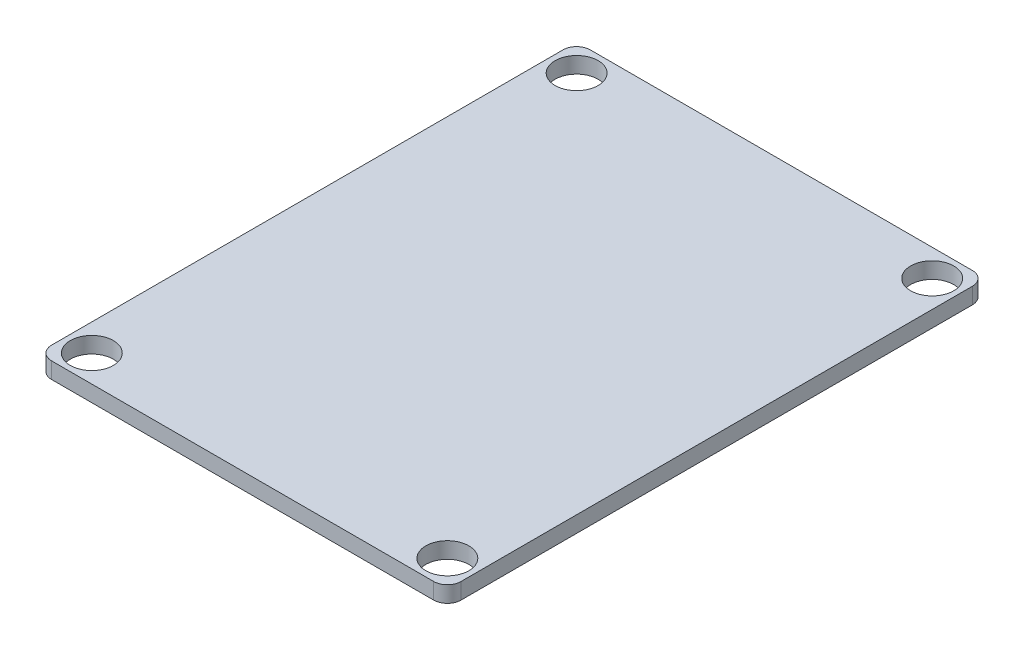
ISO-10303-21;
HEADER;
FILE_DESCRIPTION(('STEP AP214'),'2;1');
FILE_NAME('part.step','',(''),(''),'','','');
FILE_SCHEMA(('AUTOMOTIVE_DESIGN { 1 0 10303 214 1 1 1 1 }'));
ENDSEC;
DATA;
#1=APPLICATION_CONTEXT('core data for automotive mechanical design processes');
#2=APPLICATION_PROTOCOL_DEFINITION('international standard','automotive_design',2000,#1);
#3=PRODUCT_CONTEXT('',#1,'mechanical');
#4=PRODUCT('Part','Part','',(#3));
#5=PRODUCT_RELATED_PRODUCT_CATEGORY('part','',(#4));
#6=PRODUCT_DEFINITION_FORMATION('','',#4);
#7=PRODUCT_DEFINITION_CONTEXT('part definition',#1,'design');
#8=PRODUCT_DEFINITION('design','',#6,#7);
#9=PRODUCT_DEFINITION_SHAPE('','',#8);
#10=(LENGTH_UNIT() NAMED_UNIT(*) SI_UNIT(.MILLI.,.METRE.));
#11=(NAMED_UNIT(*) PLANE_ANGLE_UNIT() SI_UNIT($,.RADIAN.));
#12=(NAMED_UNIT(*) SI_UNIT($,.STERADIAN.) SOLID_ANGLE_UNIT());
#13=UNCERTAINTY_MEASURE_WITH_UNIT(LENGTH_MEASURE(1.E-05),#10,'distance_accuracy_value','');
#14=(GEOMETRIC_REPRESENTATION_CONTEXT(3) GLOBAL_UNCERTAINTY_ASSIGNED_CONTEXT((#13)) GLOBAL_UNIT_ASSIGNED_CONTEXT((#10,
#11,#12)) REPRESENTATION_CONTEXT('',''));
#15=CARTESIAN_POINT('',(0.,0.,0.));
#16=DIRECTION('',(0.,0.,1.));
#17=DIRECTION('',(1.,0.,0.));
#18=AXIS2_PLACEMENT_3D('',#15,#16,#17);
#19=CARTESIAN_POINT('',(38.,1.5,50.));
#20=DIRECTION('',(-1.,0.,0.));
#21=DIRECTION('',(0.,0.,1.));
#22=AXIS2_PLACEMENT_3D('',#19,#20,#21);
#23=PLANE('',#22);
#24=DIRECTION('',(0.,0.,-1.));
#25=VECTOR('',#24,1.);
#26=CARTESIAN_POINT('',(38.,-1.5,50.));
#27=LINE('',#26,#25);
#28=CARTESIAN_POINT('',(38.,-1.5,47.46));
#29=VERTEX_POINT('',#28);
#30=CARTESIAN_POINT('',(38.,-1.5,-47.46));
#31=VERTEX_POINT('',#30);
#32=EDGE_CURVE('E148',#29,#31,#27,.T.);
#33=ORIENTED_EDGE('',*,*,#32,.T.);
#34=DIRECTION('',(0.,-1.,0.));
#35=VECTOR('',#34,1.);
#36=CARTESIAN_POINT('',(38.,1.5,-47.46));
#37=LINE('',#36,#35);
#38=CARTESIAN_POINT('',(38.,1.5,-47.46));
#39=VERTEX_POINT('',#38);
#40=EDGE_CURVE('E181',#31,#39,#37,.F.);
#41=ORIENTED_EDGE('',*,*,#40,.T.);
#42=DIRECTION('',(0.,0.,-1.));
#43=VECTOR('',#42,1.);
#44=CARTESIAN_POINT('',(38.,1.5,50.));
#45=LINE('',#44,#43);
#46=CARTESIAN_POINT('',(38.,1.5,47.46));
#47=VERTEX_POINT('',#46);
#48=EDGE_CURVE('E146',#47,#39,#45,.T.);
#49=ORIENTED_EDGE('',*,*,#48,.F.);
#50=DIRECTION('',(0.,-1.,0.));
#51=VECTOR('',#50,1.);
#52=CARTESIAN_POINT('',(38.,1.5,47.46));
#53=LINE('',#52,#51);
#54=EDGE_CURVE('E177',#47,#29,#53,.T.);
#55=ORIENTED_EDGE('',*,*,#54,.T.);
#56=EDGE_LOOP('',(#33,#41,#49,#55));
#57=FACE_BOUND('',#56,.T.);
#58=ADVANCED_FACE('F45',(#57),#23,.F.);
#59=CARTESIAN_POINT('',(-38.,1.5,-50.));
#60=DIRECTION('',(0.,0.,1.));
#61=DIRECTION('',(1.,0.,0.));
#62=AXIS2_PLACEMENT_3D('',#59,#60,#61);
#63=PLANE('',#62);
#64=DIRECTION('',(-1.,0.,0.));
#65=VECTOR('',#64,1.);
#66=CARTESIAN_POINT('',(-38.,-1.5,-50.));
#67=LINE('',#66,#65);
#68=CARTESIAN_POINT('',(35.46,-1.5,-50.));
#69=VERTEX_POINT('',#68);
#70=CARTESIAN_POINT('',(-35.46,-1.5,-50.));
#71=VERTEX_POINT('',#70);
#72=EDGE_CURVE('E142',#69,#71,#67,.T.);
#73=ORIENTED_EDGE('',*,*,#72,.T.);
#74=DIRECTION('',(0.,-1.,0.));
#75=VECTOR('',#74,1.);
#76=CARTESIAN_POINT('',(-35.46,1.5,-50.));
#77=LINE('',#76,#75);
#78=CARTESIAN_POINT('',(-35.46,1.5,-50.));
#79=VERTEX_POINT('',#78);
#80=EDGE_CURVE('E117',#71,#79,#77,.F.);
#81=ORIENTED_EDGE('',*,*,#80,.T.);
#82=DIRECTION('',(-1.,0.,0.));
#83=VECTOR('',#82,1.);
#84=CARTESIAN_POINT('',(-38.,1.5,-50.));
#85=LINE('',#84,#83);
#86=CARTESIAN_POINT('',(35.46,1.5,-50.));
#87=VERTEX_POINT('',#86);
#88=EDGE_CURVE('E188',#87,#79,#85,.T.);
#89=ORIENTED_EDGE('',*,*,#88,.F.);
#90=DIRECTION('',(0.,-1.,0.));
#91=VECTOR('',#90,1.);
#92=CARTESIAN_POINT('',(35.46,1.5,-50.));
#93=LINE('',#92,#91);
#94=EDGE_CURVE('E123',#87,#69,#93,.T.);
#95=ORIENTED_EDGE('',*,*,#94,.T.);
#96=EDGE_LOOP('',(#73,#81,#89,#95));
#97=FACE_BOUND('',#96,.T.);
#98=ADVANCED_FACE('F250',(#97),#63,.F.);
#99=CARTESIAN_POINT('',(-38.,1.5,50.));
#100=DIRECTION('',(1.,0.,0.));
#101=DIRECTION('',(0.,0.,-1.));
#102=AXIS2_PLACEMENT_3D('',#99,#100,#101);
#103=PLANE('',#102);
#104=DIRECTION('',(0.,0.,1.));
#105=VECTOR('',#104,1.);
#106=CARTESIAN_POINT('',(-38.,1.5,50.));
#107=LINE('',#106,#105);
#108=CARTESIAN_POINT('',(-38.,1.5,-47.46));
#109=VERTEX_POINT('',#108);
#110=CARTESIAN_POINT('',(-38.,1.5,47.46));
#111=VERTEX_POINT('',#110);
#112=EDGE_CURVE('E132',#109,#111,#107,.T.);
#113=ORIENTED_EDGE('',*,*,#112,.F.);
#114=DIRECTION('',(0.,-1.,0.));
#115=VECTOR('',#114,1.);
#116=CARTESIAN_POINT('',(-38.,1.5,-47.46));
#117=LINE('',#116,#115);
#118=CARTESIAN_POINT('',(-38.,-1.5,-47.46));
#119=VERTEX_POINT('',#118);
#120=EDGE_CURVE('E116',#109,#119,#117,.T.);
#121=ORIENTED_EDGE('',*,*,#120,.T.);
#122=DIRECTION('',(0.,0.,1.));
#123=VECTOR('',#122,1.);
#124=CARTESIAN_POINT('',(-38.,-1.5,50.));
#125=LINE('',#124,#123);
#126=CARTESIAN_POINT('',(-38.,-1.5,47.46));
#127=VERTEX_POINT('',#126);
#128=EDGE_CURVE('E130',#119,#127,#125,.T.);
#129=ORIENTED_EDGE('',*,*,#128,.T.);
#130=DIRECTION('',(0.,-1.,0.));
#131=VECTOR('',#130,1.);
#132=CARTESIAN_POINT('',(-38.,1.5,47.46));
#133=LINE('',#132,#131);
#134=EDGE_CURVE('E135',#127,#111,#133,.F.);
#135=ORIENTED_EDGE('',*,*,#134,.T.);
#136=EDGE_LOOP('',(#113,#121,#129,#135));
#137=FACE_BOUND('',#136,.T.);
#138=ADVANCED_FACE('F129',(#137),#103,.F.);
#139=CARTESIAN_POINT('',(-38.,1.5,50.));
#140=DIRECTION('',(0.,0.,-1.));
#141=DIRECTION('',(-1.,0.,0.));
#142=AXIS2_PLACEMENT_3D('',#139,#140,#141);
#143=PLANE('',#142);
#144=DIRECTION('',(1.,0.,0.));
#145=VECTOR('',#144,1.);
#146=CARTESIAN_POINT('',(-38.,1.5,50.));
#147=LINE('',#146,#145);
#148=CARTESIAN_POINT('',(-35.46,1.5,50.));
#149=VERTEX_POINT('',#148);
#150=CARTESIAN_POINT('',(35.46,1.5,50.));
#151=VERTEX_POINT('',#150);
#152=EDGE_CURVE('E153',#149,#151,#147,.T.);
#153=ORIENTED_EDGE('',*,*,#152,.F.);
#154=DIRECTION('',(0.,-1.,0.));
#155=VECTOR('',#154,1.);
#156=CARTESIAN_POINT('',(-35.46,1.5,50.));
#157=LINE('',#156,#155);
#158=CARTESIAN_POINT('',(-35.46,-1.5,50.));
#159=VERTEX_POINT('',#158);
#160=EDGE_CURVE('E11',#149,#159,#157,.T.);
#161=ORIENTED_EDGE('',*,*,#160,.T.);
#162=DIRECTION('',(1.,0.,0.));
#163=VECTOR('',#162,1.);
#164=CARTESIAN_POINT('',(-38.,-1.5,50.));
#165=LINE('',#164,#163);
#166=CARTESIAN_POINT('',(35.46,-1.5,50.));
#167=VERTEX_POINT('',#166);
#168=EDGE_CURVE('E141',#159,#167,#165,.T.);
#169=ORIENTED_EDGE('',*,*,#168,.T.);
#170=DIRECTION('',(0.,-1.,0.));
#171=VECTOR('',#170,1.);
#172=CARTESIAN_POINT('',(35.46,1.5,50.));
#173=LINE('',#172,#171);
#174=EDGE_CURVE('E54',#167,#151,#173,.F.);
#175=ORIENTED_EDGE('',*,*,#174,.T.);
#176=EDGE_LOOP('',(#153,#161,#169,#175));
#177=FACE_BOUND('',#176,.T.);
#178=ADVANCED_FACE('F243',(#177),#143,.F.);
#179=CARTESIAN_POINT('',(0.,1.5,0.));
#180=DIRECTION('',(0.,-1.,0.));
#181=DIRECTION('',(0.,0.,-1.));
#182=AXIS2_PLACEMENT_3D('',#179,#180,#181);
#183=PLANE('',#182);
#184=CARTESIAN_POINT('',(-33.,1.5,45.));
#185=DIRECTION('',(0.,1.,0.));
#186=DIRECTION('',(0.,0.,1.));
#187=AXIS2_PLACEMENT_3D('',#184,#185,#186);
#188=CIRCLE('',#187,4.);
#189=CARTESIAN_POINT('',(-33.,1.5,49.));
#190=VERTEX_POINT('',#189);
#191=EDGE_CURVE('E218',#190,#190,#188,.T.);
#192=ORIENTED_EDGE('',*,*,#191,.F.);
#193=EDGE_LOOP('',(#192));
#194=FACE_BOUND('',#193,.T.);
#195=CARTESIAN_POINT('',(33.,1.5,45.));
#196=DIRECTION('',(0.,1.,0.));
#197=DIRECTION('',(0.,0.,1.));
#198=AXIS2_PLACEMENT_3D('',#195,#196,#197);
#199=CIRCLE('',#198,4.);
#200=CARTESIAN_POINT('',(33.,1.5,49.));
#201=VERTEX_POINT('',#200);
#202=EDGE_CURVE('E226',#201,#201,#199,.T.);
#203=ORIENTED_EDGE('',*,*,#202,.F.);
#204=EDGE_LOOP('',(#203));
#205=FACE_BOUND('',#204,.T.);
#206=CARTESIAN_POINT('',(33.,1.5,-45.));
#207=DIRECTION('',(0.,1.,0.));
#208=DIRECTION('',(0.,0.,1.));
#209=AXIS2_PLACEMENT_3D('',#206,#207,#208);
#210=CIRCLE('',#209,4.);
#211=CARTESIAN_POINT('',(33.,1.5,-41.));
#212=VERTEX_POINT('',#211);
#213=EDGE_CURVE('E212',#212,#212,#210,.T.);
#214=ORIENTED_EDGE('',*,*,#213,.F.);
#215=EDGE_LOOP('',(#214));
#216=FACE_BOUND('',#215,.T.);
#217=CARTESIAN_POINT('',(-33.,1.5,-45.));
#218=DIRECTION('',(0.,1.,0.));
#219=DIRECTION('',(0.,0.,1.));
#220=AXIS2_PLACEMENT_3D('',#217,#218,#219);
#221=CIRCLE('',#220,4.);
#222=CARTESIAN_POINT('',(-33.,1.5,-41.));
#223=VERTEX_POINT('',#222);
#224=EDGE_CURVE('E198',#223,#223,#221,.T.);
#225=ORIENTED_EDGE('',*,*,#224,.F.);
#226=EDGE_LOOP('',(#225));
#227=FACE_BOUND('',#226,.T.);
#228=ORIENTED_EDGE('',*,*,#88,.T.);
#229=CARTESIAN_POINT('',(-35.46,1.5,-47.46));
#230=DIRECTION('',(0.,-1.,0.));
#231=DIRECTION('',(0.,0.,-1.));
#232=AXIS2_PLACEMENT_3D('',#229,#230,#231);
#233=CIRCLE('',#232,2.54);
#234=EDGE_CURVE('E174',#79,#109,#233,.F.);
#235=ORIENTED_EDGE('',*,*,#234,.T.);
#236=ORIENTED_EDGE('',*,*,#112,.T.);
#237=CARTESIAN_POINT('',(-35.46,1.5,47.46));
#238=DIRECTION('',(0.,-1.,0.));
#239=DIRECTION('',(0.,0.,-1.));
#240=AXIS2_PLACEMENT_3D('',#237,#238,#239);
#241=CIRCLE('',#240,2.54);
#242=EDGE_CURVE('E67',#111,#149,#241,.F.);
#243=ORIENTED_EDGE('',*,*,#242,.T.);
#244=ORIENTED_EDGE('',*,*,#152,.T.);
#245=CARTESIAN_POINT('',(35.46,1.5,47.46));
#246=DIRECTION('',(0.,-1.,0.));
#247=DIRECTION('',(0.,0.,-1.));
#248=AXIS2_PLACEMENT_3D('',#245,#246,#247);
#249=CIRCLE('',#248,2.54);
#250=EDGE_CURVE('E166',#151,#47,#249,.F.);
#251=ORIENTED_EDGE('',*,*,#250,.T.);
#252=ORIENTED_EDGE('',*,*,#48,.T.);
#253=CARTESIAN_POINT('',(35.46,1.5,-47.46));
#254=DIRECTION('',(0.,-1.,0.));
#255=DIRECTION('',(0.,0.,-1.));
#256=AXIS2_PLACEMENT_3D('',#253,#254,#255);
#257=CIRCLE('',#256,2.54);
#258=EDGE_CURVE('E171',#39,#87,#257,.F.);
#259=ORIENTED_EDGE('',*,*,#258,.T.);
#260=EDGE_LOOP('',(#228,#235,#236,#243,#244,#251,#252,#259));
#261=FACE_BOUND('',#260,.T.);
#262=ADVANCED_FACE('F240',(#194,#205,#216,#227,#261),#183,.F.);
#263=CARTESIAN_POINT('',(0.,-1.5,0.));
#264=DIRECTION('',(0.,-1.,0.));
#265=DIRECTION('',(0.,0.,-1.));
#266=AXIS2_PLACEMENT_3D('',#263,#264,#265);
#267=PLANE('',#266);
#268=CARTESIAN_POINT('',(-33.,-1.5,45.));
#269=DIRECTION('',(0.,1.,0.));
#270=DIRECTION('',(0.,0.,1.));
#271=AXIS2_PLACEMENT_3D('',#268,#269,#270);
#272=CIRCLE('',#271,4.);
#273=CARTESIAN_POINT('',(-33.,-1.5,49.));
#274=VERTEX_POINT('',#273);
#275=EDGE_CURVE('E214',#274,#274,#272,.T.);
#276=ORIENTED_EDGE('',*,*,#275,.T.);
#277=EDGE_LOOP('',(#276));
#278=FACE_BOUND('',#277,.T.);
#279=CARTESIAN_POINT('',(33.,-1.5,45.));
#280=DIRECTION('',(0.,1.,0.));
#281=DIRECTION('',(0.,0.,1.));
#282=AXIS2_PLACEMENT_3D('',#279,#280,#281);
#283=CIRCLE('',#282,4.);
#284=CARTESIAN_POINT('',(33.,-1.5,49.));
#285=VERTEX_POINT('',#284);
#286=EDGE_CURVE('E222',#285,#285,#283,.T.);
#287=ORIENTED_EDGE('',*,*,#286,.T.);
#288=EDGE_LOOP('',(#287));
#289=FACE_BOUND('',#288,.T.);
#290=CARTESIAN_POINT('',(33.,-1.5,-45.));
#291=DIRECTION('',(0.,1.,0.));
#292=DIRECTION('',(0.,0.,1.));
#293=AXIS2_PLACEMENT_3D('',#290,#291,#292);
#294=CIRCLE('',#293,4.);
#295=CARTESIAN_POINT('',(33.,-1.5,-41.));
#296=VERTEX_POINT('',#295);
#297=EDGE_CURVE('E230',#296,#296,#294,.T.);
#298=ORIENTED_EDGE('',*,*,#297,.T.);
#299=EDGE_LOOP('',(#298));
#300=FACE_BOUND('',#299,.T.);
#301=CARTESIAN_POINT('',(-33.,-1.5,-45.));
#302=DIRECTION('',(0.,1.,0.));
#303=DIRECTION('',(0.,0.,1.));
#304=AXIS2_PLACEMENT_3D('',#301,#302,#303);
#305=CIRCLE('',#304,4.);
#306=CARTESIAN_POINT('',(-33.,-1.5,-41.));
#307=VERTEX_POINT('',#306);
#308=EDGE_CURVE('E202',#307,#307,#305,.T.);
#309=ORIENTED_EDGE('',*,*,#308,.T.);
#310=EDGE_LOOP('',(#309));
#311=FACE_BOUND('',#310,.T.);
#312=ORIENTED_EDGE('',*,*,#128,.F.);
#313=CARTESIAN_POINT('',(-35.46,-1.5,-47.46));
#314=DIRECTION('',(0.,-1.,0.));
#315=DIRECTION('',(0.,0.,-1.));
#316=AXIS2_PLACEMENT_3D('',#313,#314,#315);
#317=CIRCLE('',#316,2.54);
#318=EDGE_CURVE('E112',#119,#71,#317,.T.);
#319=ORIENTED_EDGE('',*,*,#318,.T.);
#320=ORIENTED_EDGE('',*,*,#72,.F.);
#321=CARTESIAN_POINT('',(35.46,-1.5,-47.46));
#322=DIRECTION('',(0.,-1.,0.));
#323=DIRECTION('',(0.,0.,-1.));
#324=AXIS2_PLACEMENT_3D('',#321,#322,#323);
#325=CIRCLE('',#324,2.54);
#326=EDGE_CURVE('E124',#69,#31,#325,.T.);
#327=ORIENTED_EDGE('',*,*,#326,.T.);
#328=ORIENTED_EDGE('',*,*,#32,.F.);
#329=CARTESIAN_POINT('',(35.46,-1.5,47.46));
#330=DIRECTION('',(0.,-1.,0.));
#331=DIRECTION('',(0.,0.,-1.));
#332=AXIS2_PLACEMENT_3D('',#329,#330,#331);
#333=CIRCLE('',#332,2.54);
#334=EDGE_CURVE('E134',#29,#167,#333,.T.);
#335=ORIENTED_EDGE('',*,*,#334,.T.);
#336=ORIENTED_EDGE('',*,*,#168,.F.);
#337=CARTESIAN_POINT('',(-35.46,-1.5,47.46));
#338=DIRECTION('',(0.,-1.,0.));
#339=DIRECTION('',(0.,0.,-1.));
#340=AXIS2_PLACEMENT_3D('',#337,#338,#339);
#341=CIRCLE('',#340,2.54);
#342=EDGE_CURVE('E139',#159,#127,#341,.T.);
#343=ORIENTED_EDGE('',*,*,#342,.T.);
#344=EDGE_LOOP('',(#312,#319,#320,#327,#328,#335,#336,#343));
#345=FACE_BOUND('',#344,.T.);
#346=ADVANCED_FACE('F137',(#278,#289,#300,#311,#345),#267,.T.);
#347=CARTESIAN_POINT('',(-35.46,1.5,-47.46));
#348=DIRECTION('',(0.,-1.,0.));
#349=DIRECTION('',(0.,0.,-1.));
#350=AXIS2_PLACEMENT_3D('',#347,#348,#349);
#351=CYLINDRICAL_SURFACE('',#350,2.54);
#352=ORIENTED_EDGE('',*,*,#234,.F.);
#353=ORIENTED_EDGE('',*,*,#80,.F.);
#354=ORIENTED_EDGE('',*,*,#318,.F.);
#355=ORIENTED_EDGE('',*,*,#120,.F.);
#356=EDGE_LOOP('',(#352,#353,#354,#355));
#357=FACE_BOUND('',#356,.T.);
#358=ADVANCED_FACE('F115',(#357),#351,.T.);
#359=CARTESIAN_POINT('',(35.46,1.5,-47.46));
#360=DIRECTION('',(0.,-1.,0.));
#361=DIRECTION('',(0.,0.,-1.));
#362=AXIS2_PLACEMENT_3D('',#359,#360,#361);
#363=CYLINDRICAL_SURFACE('',#362,2.54);
#364=ORIENTED_EDGE('',*,*,#258,.F.);
#365=ORIENTED_EDGE('',*,*,#40,.F.);
#366=ORIENTED_EDGE('',*,*,#326,.F.);
#367=ORIENTED_EDGE('',*,*,#94,.F.);
#368=EDGE_LOOP('',(#364,#365,#366,#367));
#369=FACE_BOUND('',#368,.T.);
#370=ADVANCED_FACE('F252',(#369),#363,.T.);
#371=CARTESIAN_POINT('',(-35.46,1.5,47.46));
#372=DIRECTION('',(0.,-1.,0.));
#373=DIRECTION('',(0.,0.,-1.));
#374=AXIS2_PLACEMENT_3D('',#371,#372,#373);
#375=CYLINDRICAL_SURFACE('',#374,2.54);
#376=ORIENTED_EDGE('',*,*,#242,.F.);
#377=ORIENTED_EDGE('',*,*,#134,.F.);
#378=ORIENTED_EDGE('',*,*,#342,.F.);
#379=ORIENTED_EDGE('',*,*,#160,.F.);
#380=EDGE_LOOP('',(#376,#377,#378,#379));
#381=FACE_BOUND('',#380,.T.);
#382=ADVANCED_FACE('F268',(#381),#375,.T.);
#383=CARTESIAN_POINT('',(35.46,1.5,47.46));
#384=DIRECTION('',(0.,-1.,0.));
#385=DIRECTION('',(0.,0.,-1.));
#386=AXIS2_PLACEMENT_3D('',#383,#384,#385);
#387=CYLINDRICAL_SURFACE('',#386,2.54);
#388=ORIENTED_EDGE('',*,*,#250,.F.);
#389=ORIENTED_EDGE('',*,*,#174,.F.);
#390=ORIENTED_EDGE('',*,*,#334,.F.);
#391=ORIENTED_EDGE('',*,*,#54,.F.);
#392=EDGE_LOOP('',(#388,#389,#390,#391));
#393=FACE_BOUND('',#392,.T.);
#394=ADVANCED_FACE('F47',(#393),#387,.T.);
#395=CARTESIAN_POINT('',(-33.,-1.5,-45.));
#396=DIRECTION('',(0.,1.,0.));
#397=DIRECTION('',(0.,0.,1.));
#398=AXIS2_PLACEMENT_3D('',#395,#396,#397);
#399=CYLINDRICAL_SURFACE('',#398,4.);
#400=ORIENTED_EDGE('',*,*,#308,.F.);
#401=EDGE_LOOP('',(#400));
#402=FACE_BOUND('',#401,.T.);
#403=ORIENTED_EDGE('',*,*,#224,.T.);
#404=EDGE_LOOP('',(#403));
#405=FACE_BOUND('',#404,.T.);
#406=ADVANCED_FACE('F274',(#402,#405),#399,.F.);
#407=CARTESIAN_POINT('',(33.,-1.5,-45.));
#408=DIRECTION('',(0.,1.,0.));
#409=DIRECTION('',(0.,0.,1.));
#410=AXIS2_PLACEMENT_3D('',#407,#408,#409);
#411=CYLINDRICAL_SURFACE('',#410,4.);
#412=ORIENTED_EDGE('',*,*,#297,.F.);
#413=EDGE_LOOP('',(#412));
#414=FACE_BOUND('',#413,.T.);
#415=ORIENTED_EDGE('',*,*,#213,.T.);
#416=EDGE_LOOP('',(#415));
#417=FACE_BOUND('',#416,.T.);
#418=ADVANCED_FACE('F238',(#414,#417),#411,.F.);
#419=CARTESIAN_POINT('',(33.,-1.5,45.));
#420=DIRECTION('',(0.,1.,0.));
#421=DIRECTION('',(0.,0.,1.));
#422=AXIS2_PLACEMENT_3D('',#419,#420,#421);
#423=CYLINDRICAL_SURFACE('',#422,4.);
#424=ORIENTED_EDGE('',*,*,#286,.F.);
#425=EDGE_LOOP('',(#424));
#426=FACE_BOUND('',#425,.T.);
#427=ORIENTED_EDGE('',*,*,#202,.T.);
#428=EDGE_LOOP('',(#427));
#429=FACE_BOUND('',#428,.T.);
#430=ADVANCED_FACE('F284',(#426,#429),#423,.F.);
#431=CARTESIAN_POINT('',(-33.,-1.5,45.));
#432=DIRECTION('',(0.,1.,0.));
#433=DIRECTION('',(0.,0.,1.));
#434=AXIS2_PLACEMENT_3D('',#431,#432,#433);
#435=CYLINDRICAL_SURFACE('',#434,4.);
#436=ORIENTED_EDGE('',*,*,#275,.F.);
#437=EDGE_LOOP('',(#436));
#438=FACE_BOUND('',#437,.T.);
#439=ORIENTED_EDGE('',*,*,#191,.T.);
#440=EDGE_LOOP('',(#439));
#441=FACE_BOUND('',#440,.T.);
#442=ADVANCED_FACE('F289',(#438,#441),#435,.F.);
#443=CLOSED_SHELL('',(#58,#98,#138,#178,#262,#346,#358,#370,#382,#394,#406,#418,#430,#442));
#444=MANIFOLD_SOLID_BREP('B2',#443);
#445=ADVANCED_BREP_SHAPE_REPRESENTATION('',(#18,#444),#14);
#446=SHAPE_DEFINITION_REPRESENTATION(#9,#445);
ENDSEC;
END-ISO-10303-21;
